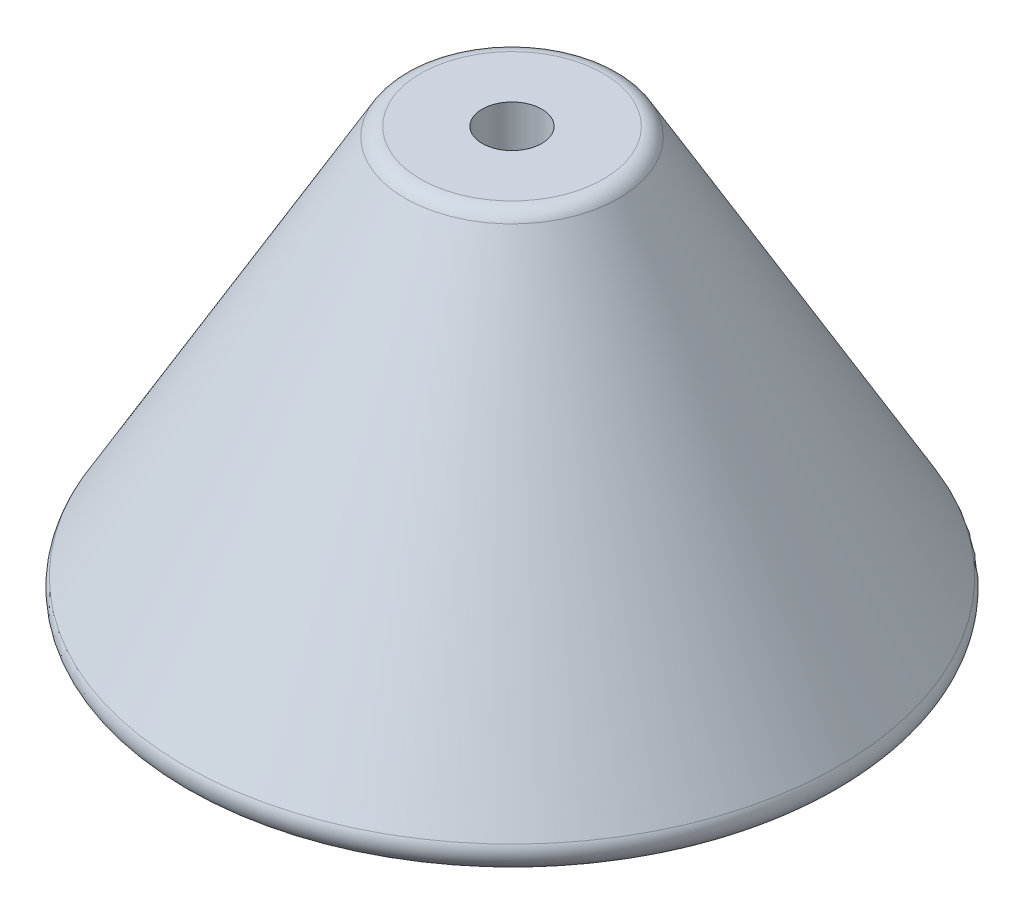
ISO-10303-21;
HEADER;
FILE_DESCRIPTION(('STEP AP214'),'2;1');
FILE_NAME('part.step','',(''),(''),'','','');
FILE_SCHEMA(('AUTOMOTIVE_DESIGN { 1 0 10303 214 1 1 1 1 }'));
ENDSEC;
DATA;
#1=APPLICATION_CONTEXT('core data for automotive mechanical design processes');
#2=APPLICATION_PROTOCOL_DEFINITION('international standard','automotive_design',2000,#1);
#3=PRODUCT_CONTEXT('',#1,'mechanical');
#4=PRODUCT('Part','Part','',(#3));
#5=PRODUCT_RELATED_PRODUCT_CATEGORY('part','',(#4));
#6=PRODUCT_DEFINITION_FORMATION('','',#4);
#7=PRODUCT_DEFINITION_CONTEXT('part definition',#1,'design');
#8=PRODUCT_DEFINITION('design','',#6,#7);
#9=PRODUCT_DEFINITION_SHAPE('','',#8);
#10=(LENGTH_UNIT() NAMED_UNIT(*) SI_UNIT(.MILLI.,.METRE.));
#11=(NAMED_UNIT(*) PLANE_ANGLE_UNIT() SI_UNIT($,.RADIAN.));
#12=(NAMED_UNIT(*) SI_UNIT($,.STERADIAN.) SOLID_ANGLE_UNIT());
#13=UNCERTAINTY_MEASURE_WITH_UNIT(LENGTH_MEASURE(1.E-05),#10,'distance_accuracy_value','');
#14=(GEOMETRIC_REPRESENTATION_CONTEXT(3) GLOBAL_UNCERTAINTY_ASSIGNED_CONTEXT((#13)) GLOBAL_UNIT_ASSIGNED_CONTEXT((#10,
#11,#12)) REPRESENTATION_CONTEXT('',''));
#15=CARTESIAN_POINT('',(0.,0.,0.));
#16=DIRECTION('',(0.,0.,1.));
#17=DIRECTION('',(1.,0.,0.));
#18=AXIS2_PLACEMENT_3D('',#15,#16,#17);
#19=CARTESIAN_POINT('',(0.,0.,0.));
#20=DIRECTION('',(0.,-1.,0.));
#21=DIRECTION('',(0.,0.,1.));
#22=AXIS2_PLACEMENT_3D('',#19,#20,#21);
#23=CONICAL_SURFACE('',#22,57.5,0.5235987755983);
#24=CARTESIAN_POINT('',(0.,68.5,0.));
#25=DIRECTION('',(0.,-1.,0.));
#26=DIRECTION('',(0.,0.,-1.));
#27=AXIS2_PLACEMENT_3D('',#24,#25,#26);
#28=CIRCLE('',#27,17.9515065605105);
#29=CARTESIAN_POINT('',(0.,68.5,17.9515065605105));
#30=VERTEX_POINT('',#29);
#31=EDGE_CURVE('E44',#30,#30,#28,.T.);
#32=CARTESIAN_POINT('',(0.,4.50000000000002,0.));
#33=DIRECTION('',(0.,1.,0.));
#34=DIRECTION('',(0.,0.,1.));
#35=AXIS2_PLACEMENT_3D('',#32,#33,#34);
#36=CIRCLE('',#35,54.9019237886467);
#37=CARTESIAN_POINT('',(0.,4.50000000000002,54.9019237886467));
#38=VERTEX_POINT('',#37);
#39=EDGE_CURVE('E48',#38,#38,#36,.T.);
#40=CARTESIAN_POINT('',(0.,68.5,17.9515065605105));
#41=CARTESIAN_POINT('',(0.,67.8333333333333,18.3364067399703));
#42=CARTESIAN_POINT('',(0.,67.1666666666667,18.72130691943));
#43=CARTESIAN_POINT('',(0.,65.8333333333333,19.4911072783495));
#44=CARTESIAN_POINT('',(0.,65.1666666666667,19.8760074578093));
#45=CARTESIAN_POINT('',(0.,63.8333333333333,20.6458078167288));
#46=CARTESIAN_POINT('',(0.,63.1666666666667,21.0307079961885));
#47=CARTESIAN_POINT('',(0.,61.8333333333333,21.800508355108));
#48=CARTESIAN_POINT('',(0.,61.1666666666667,22.1854085345678));
#49=CARTESIAN_POINT('',(0.,59.8333333333333,22.9552088934873));
#50=CARTESIAN_POINT('',(0.,59.1666666666667,23.3401090729471));
#51=CARTESIAN_POINT('',(0.,57.8333333333333,24.1099094318666));
#52=CARTESIAN_POINT('',(0.,57.1666666666667,24.4948096113263));
#53=CARTESIAN_POINT('',(0.,55.8333333333333,25.2646099702458));
#54=CARTESIAN_POINT('',(0.,55.1666666666667,25.6495101497056));
#55=CARTESIAN_POINT('',(0.,53.8333333333333,26.4193105086251));
#56=CARTESIAN_POINT('',(0.,53.1666666666667,26.8042106880848));
#57=CARTESIAN_POINT('',(0.,51.8333333333333,27.5740110470043));
#58=CARTESIAN_POINT('',(0.,51.1666666666667,27.9589112264641));
#59=CARTESIAN_POINT('',(0.,49.8333333333333,28.7287115853836));
#60=CARTESIAN_POINT('',(0.,49.1666666666667,29.1136117648433));
#61=CARTESIAN_POINT('',(0.,47.8333333333333,29.8834121237628));
#62=CARTESIAN_POINT('',(0.,47.1666666666667,30.2683123032226));
#63=CARTESIAN_POINT('',(0.,45.8333333333333,31.0381126621421));
#64=CARTESIAN_POINT('',(0.,45.1666666666667,31.4230128416018));
#65=CARTESIAN_POINT('',(0.,43.8333333333333,32.1928132005213));
#66=CARTESIAN_POINT('',(0.,43.1666666666667,32.5777133799811));
#67=CARTESIAN_POINT('',(0.,41.8333333333333,33.3475137389006));
#68=CARTESIAN_POINT('',(0.,41.1666666666667,33.7324139183603));
#69=CARTESIAN_POINT('',(0.,39.8333333333333,34.5022142772798));
#70=CARTESIAN_POINT('',(0.,39.1666666666667,34.8871144567396));
#71=CARTESIAN_POINT('',(0.,37.8333333333333,35.6569148156591));
#72=CARTESIAN_POINT('',(0.,37.1666666666667,36.0418149951188));
#73=CARTESIAN_POINT('',(0.,35.8333333333333,36.8116153540384));
#74=CARTESIAN_POINT('',(0.,35.1666666666667,37.1965155334981));
#75=CARTESIAN_POINT('',(0.,33.8333333333333,37.9663158924176));
#76=CARTESIAN_POINT('',(0.,33.1666666666667,38.3512160718774));
#77=CARTESIAN_POINT('',(0.,31.8333333333333,39.1210164307969));
#78=CARTESIAN_POINT('',(0.,31.1666666666667,39.5059166102566));
#79=CARTESIAN_POINT('',(0.,29.8333333333333,40.2757169691761));
#80=CARTESIAN_POINT('',(0.,29.1666666666667,40.6606171486359));
#81=CARTESIAN_POINT('',(0.,27.8333333333333,41.4304175075554));
#82=CARTESIAN_POINT('',(0.,27.1666666666667,41.8153176870151));
#83=CARTESIAN_POINT('',(0.,25.8333333333333,42.5851180459346));
#84=CARTESIAN_POINT('',(0.,25.1666666666667,42.9700182253944));
#85=CARTESIAN_POINT('',(0.,23.8333333333333,43.7398185843139));
#86=CARTESIAN_POINT('',(0.,23.1666666666667,44.1247187637736));
#87=CARTESIAN_POINT('',(0.,21.8333333333333,44.8945191226931));
#88=CARTESIAN_POINT('',(0.,21.1666666666667,45.2794193021529));
#89=CARTESIAN_POINT('',(0.,19.8333333333334,46.0492196610724));
#90=CARTESIAN_POINT('',(0.,19.1666666666667,46.4341198405321));
#91=CARTESIAN_POINT('',(0.,17.8333333333333,47.2039201994516));
#92=CARTESIAN_POINT('',(0.,17.1666666666667,47.5888203789114));
#93=CARTESIAN_POINT('',(0.,15.8333333333333,48.3586207378309));
#94=CARTESIAN_POINT('',(0.,15.1666666666667,48.7435209172906));
#95=CARTESIAN_POINT('',(0.,13.8333333333333,49.5133212762101));
#96=CARTESIAN_POINT('',(0.,13.1666666666667,49.8982214556699));
#97=CARTESIAN_POINT('',(0.,11.8333333333333,50.6680218145894));
#98=CARTESIAN_POINT('',(0.,11.1666666666667,51.0529219940492));
#99=CARTESIAN_POINT('',(0.,9.83333333333335,51.8227223529687));
#100=CARTESIAN_POINT('',(0.,9.16666666666668,52.2076225324284));
#101=CARTESIAN_POINT('',(0.,7.83333333333335,52.9774228913479));
#102=CARTESIAN_POINT('',(0.,7.16666666666668,53.3623230708077));
#103=CARTESIAN_POINT('',(0.,5.83333333333335,54.1321234297272));
#104=CARTESIAN_POINT('',(0.,5.16666666666669,54.5170236091869));
#105=CARTESIAN_POINT('',(0.,4.50000000000002,54.9019237886467));
#106=B_SPLINE_CURVE_WITH_KNOTS('',3,(#40,#41,#42,#43,#44,#45,#46,#47,#48,#49,#50,#51,#52,#53,
#54,#55,#56,#57,#58,#59,#60,#61,#62,#63,#64,#65,#66,#67,#68,#69,#70,#71,#72,#73,#74,#75,#76,#77,
#78,#79,#80,#81,#82,#83,#84,#85,#86,#87,#88,#89,#90,#91,#92,#93,#94,#95,#96,#97,#98,#99,#100,
#101,#102,#103,#104,#105),.UNSPECIFIED.,.F.,.F.,(4,2,2,2,2,2,2,2,2,2,2,2,2,2,2,2,2,2,2,2,2,2,2,
2,2,2,2,2,2,2,2,2,4),(0.,2.30940107675851,4.61880215351701,6.92820323027552,9.23760430703402,
11.5470053837925,13.856406460551,16.1658075373095,18.475208614068,20.7846096908265,
23.094010767585,25.4034118443435,27.712812921102,30.0222139978606,32.3316150746191,
34.6410161513776,36.9504172281361,39.2598183048946,41.5692193816531,43.8786204584116,
46.1880215351701,48.4974226119286,50.8068236886871,53.1162247654456,55.4256258422041,
57.7350269189626,60.0444279957211,62.3538290724796,64.6632301492381,66.9726312259966,
69.2820323027551,71.5914333795136,73.9008344562722),.UNSPECIFIED.);
#107=EDGE_CURVE('BSEAM37',#30,#38,#106,.T.);
#108=ORIENTED_EDGE('',*,*,#31,.T.);
#109=ORIENTED_EDGE('',*,*,#39,.T.);
#110=ORIENTED_EDGE('',*,*,#107,.T.);
#111=ORIENTED_EDGE('',*,*,#107,.F.);
#112=EDGE_LOOP('',(#108,#110,#109,#111));
#113=FACE_BOUND('',#112,.T.);
#114=ADVANCED_FACE('F37',(#113),#23,.T.);
#115=CARTESIAN_POINT('',(0.,70.,0.));
#116=DIRECTION('',(0.,1.,0.));
#117=DIRECTION('',(0.,0.,1.));
#118=AXIS2_PLACEMENT_3D('',#115,#116,#117);
#119=PLANE('',#118);
#120=CARTESIAN_POINT('',(0.,70.,0.));
#121=DIRECTION('',(0.,1.,0.));
#122=DIRECTION('',(0.,0.,1.));
#123=AXIS2_PLACEMENT_3D('',#120,#121,#122);
#124=CIRCLE('',#123,15.3534303491572);
#125=CARTESIAN_POINT('',(0.,70.,15.3534303491572));
#126=VERTEX_POINT('',#125);
#127=EDGE_CURVE('E52',#126,#126,#124,.T.);
#128=ORIENTED_EDGE('',*,*,#127,.T.);
#129=EDGE_LOOP('',(#128));
#130=FACE_BOUND('',#129,.T.);
#131=CARTESIAN_POINT('',(0.,70.,0.));
#132=DIRECTION('',(0.,-1.,0.));
#133=DIRECTION('',(0.,0.,-1.));
#134=AXIS2_PLACEMENT_3D('',#131,#132,#133);
#135=CIRCLE('',#134,5.);
#136=CARTESIAN_POINT('',(0.,70.,-5.));
#137=VERTEX_POINT('',#136);
#138=EDGE_CURVE('E57',#137,#137,#135,.T.);
#139=ORIENTED_EDGE('',*,*,#138,.T.);
#140=EDGE_LOOP('',(#139));
#141=FACE_BOUND('',#140,.T.);
#142=ADVANCED_FACE('F64',(#130,#141),#119,.T.);
#143=CARTESIAN_POINT('',(0.,0.,0.));
#144=DIRECTION('',(0.,1.,0.));
#145=DIRECTION('',(0.,0.,1.));
#146=AXIS2_PLACEMENT_3D('',#143,#144,#145);
#147=PLANE('',#146);
#148=CARTESIAN_POINT('',(0.,0.,0.));
#149=DIRECTION('',(0.,1.,0.));
#150=DIRECTION('',(0.,0.,1.));
#151=AXIS2_PLACEMENT_3D('',#148,#149,#150);
#152=CIRCLE('',#151,52.3038475772934);
#153=CARTESIAN_POINT('',(0.,0.,52.3038475772934));
#154=VERTEX_POINT('',#153);
#155=EDGE_CURVE('E10',#154,#154,#152,.F.);
#156=ORIENTED_EDGE('',*,*,#155,.T.);
#157=EDGE_LOOP('',(#156));
#158=FACE_BOUND('',#157,.T.);
#159=CARTESIAN_POINT('',(0.,0.,0.));
#160=DIRECTION('',(0.,-1.,0.));
#161=DIRECTION('',(0.,0.,-1.));
#162=AXIS2_PLACEMENT_3D('',#159,#160,#161);
#163=CIRCLE('',#162,5.);
#164=CARTESIAN_POINT('',(0.,0.,-5.));
#165=VERTEX_POINT('',#164);
#166=EDGE_CURVE('E58',#165,#165,#163,.T.);
#167=ORIENTED_EDGE('',*,*,#166,.F.);
#168=EDGE_LOOP('',(#167));
#169=FACE_BOUND('',#168,.T.);
#170=ADVANCED_FACE('F70',(#158,#169),#147,.F.);
#171=CARTESIAN_POINT('',(0.,70.,0.));
#172=DIRECTION('',(0.,-1.,0.));
#173=DIRECTION('',(0.,0.,-1.));
#174=AXIS2_PLACEMENT_3D('',#171,#172,#173);
#175=CYLINDRICAL_SURFACE('',#174,5.);
#176=ORIENTED_EDGE('',*,*,#138,.F.);
#177=EDGE_LOOP('',(#176));
#178=FACE_BOUND('',#177,.T.);
#179=ORIENTED_EDGE('',*,*,#166,.T.);
#180=EDGE_LOOP('',(#179));
#181=FACE_BOUND('',#180,.T.);
#182=ADVANCED_FACE('F66',(#178,#181),#175,.F.);
#183=CARTESIAN_POINT('',(0.,67.,0.));
#184=DIRECTION('',(0.,1.,0.));
#185=DIRECTION('',(0.,0.,1.));
#186=AXIS2_PLACEMENT_3D('',#183,#184,#185);
#187=TOROIDAL_SURFACE('',#186,15.3534303491572,3.);
#188=ORIENTED_EDGE('',*,*,#31,.F.);
#189=EDGE_LOOP('',(#188));
#190=FACE_BOUND('',#189,.T.);
#191=ORIENTED_EDGE('',*,*,#127,.F.);
#192=EDGE_LOOP('',(#191));
#193=FACE_BOUND('',#192,.T.);
#194=ADVANCED_FACE('F69',(#190,#193),#187,.T.);
#195=CARTESIAN_POINT('',(0.,3.,0.));
#196=DIRECTION('',(0.,1.,0.));
#197=DIRECTION('',(0.,0.,1.));
#198=AXIS2_PLACEMENT_3D('',#195,#196,#197);
#199=TOROIDAL_SURFACE('',#198,52.3038475772934,3.);
#200=ORIENTED_EDGE('',*,*,#155,.F.);
#201=EDGE_LOOP('',(#200));
#202=FACE_BOUND('',#201,.T.);
#203=ORIENTED_EDGE('',*,*,#39,.F.);
#204=EDGE_LOOP('',(#203));
#205=FACE_BOUND('',#204,.T.);
#206=ADVANCED_FACE('F39',(#202,#205),#199,.T.);
#207=CLOSED_SHELL('',(#114,#142,#170,#182,#194,#206));
#208=MANIFOLD_SOLID_BREP('B2',#207);
#209=ADVANCED_BREP_SHAPE_REPRESENTATION('',(#18,#208),#14);
#210=SHAPE_DEFINITION_REPRESENTATION(#9,#209);
ENDSEC;
END-ISO-10303-21;
